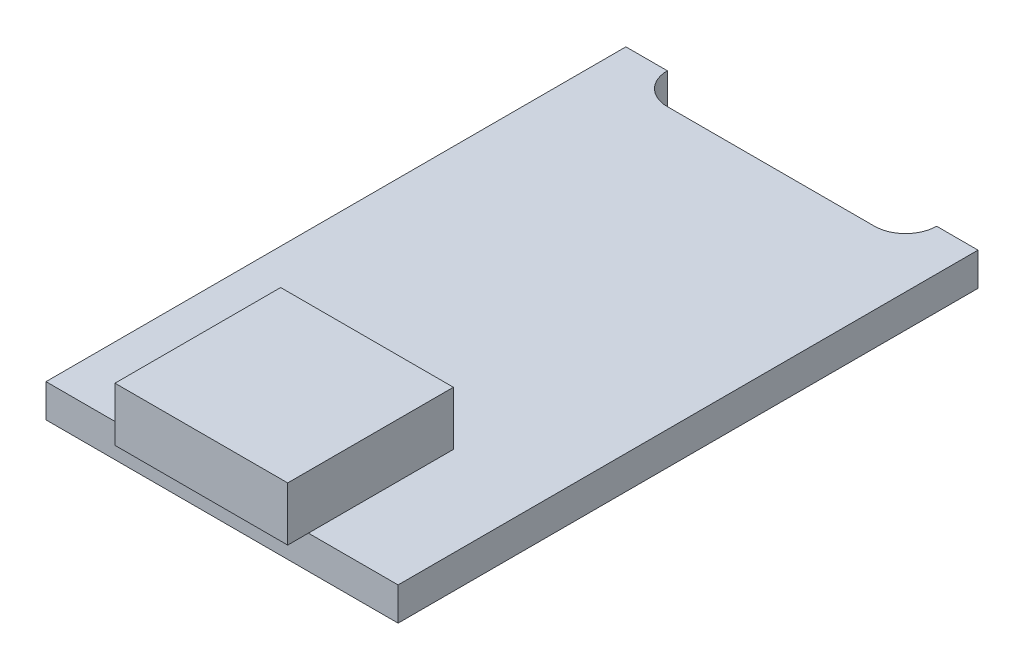
ISO-10303-21;
HEADER;
FILE_DESCRIPTION(('STEP AP214'),'2;1');
FILE_NAME('part.step','',(''),(''),'','','');
FILE_SCHEMA(('AUTOMOTIVE_DESIGN { 1 0 10303 214 1 1 1 1 }'));
ENDSEC;
DATA;
#1=APPLICATION_CONTEXT('core data for automotive mechanical design processes');
#2=APPLICATION_PROTOCOL_DEFINITION('international standard','automotive_design',2000,#1);
#3=PRODUCT_CONTEXT('',#1,'mechanical');
#4=PRODUCT('Part','Part','',(#3));
#5=PRODUCT_RELATED_PRODUCT_CATEGORY('part','',(#4));
#6=PRODUCT_DEFINITION_FORMATION('','',#4);
#7=PRODUCT_DEFINITION_CONTEXT('part definition',#1,'design');
#8=PRODUCT_DEFINITION('design','',#6,#7);
#9=PRODUCT_DEFINITION_SHAPE('','',#8);
#10=(LENGTH_UNIT() NAMED_UNIT(*) SI_UNIT(.MILLI.,.METRE.));
#11=(NAMED_UNIT(*) PLANE_ANGLE_UNIT() SI_UNIT($,.RADIAN.));
#12=(NAMED_UNIT(*) SI_UNIT($,.STERADIAN.) SOLID_ANGLE_UNIT());
#13=UNCERTAINTY_MEASURE_WITH_UNIT(LENGTH_MEASURE(1.E-05),#10,'distance_accuracy_value','');
#14=(GEOMETRIC_REPRESENTATION_CONTEXT(3) GLOBAL_UNCERTAINTY_ASSIGNED_CONTEXT((#13)) GLOBAL_UNIT_ASSIGNED_CONTEXT((#10,
#11,#12)) REPRESENTATION_CONTEXT('',''));
#15=CARTESIAN_POINT('',(0.,0.,0.));
#16=DIRECTION('',(0.,0.,1.));
#17=DIRECTION('',(1.,0.,0.));
#18=AXIS2_PLACEMENT_3D('',#15,#16,#17);
#19=CARTESIAN_POINT('',(-8.5,1.6,-14.));
#20=DIRECTION('',(0.,0.,1.));
#21=DIRECTION('',(1.,0.,0.));
#22=AXIS2_PLACEMENT_3D('',#19,#20,#21);
#23=PLANE('',#22);
#24=DIRECTION('',(-1.,0.,0.));
#25=VECTOR('',#24,1.);
#26=CARTESIAN_POINT('',(-8.5,1.6,-14.));
#27=LINE('',#26,#25);
#28=CARTESIAN_POINT('',(-6.5,1.6,-14.));
#29=VERTEX_POINT('',#28);
#30=CARTESIAN_POINT('',(-8.5,1.6,-14.));
#31=VERTEX_POINT('',#30);
#32=EDGE_CURVE('E225',#29,#31,#27,.T.);
#33=ORIENTED_EDGE('',*,*,#32,.F.);
#34=DIRECTION('',(0.,1.,0.));
#35=VECTOR('',#34,1.);
#36=CARTESIAN_POINT('',(-6.5,0.,-14.));
#37=LINE('',#36,#35);
#38=CARTESIAN_POINT('',(-6.5,0.,-14.));
#39=VERTEX_POINT('',#38);
#40=EDGE_CURVE('E189',#29,#39,#37,.F.);
#41=ORIENTED_EDGE('',*,*,#40,.T.);
#42=DIRECTION('',(-1.,0.,0.));
#43=VECTOR('',#42,1.);
#44=CARTESIAN_POINT('',(-8.5,0.,-14.));
#45=LINE('',#44,#43);
#46=CARTESIAN_POINT('',(-8.5,0.,-14.));
#47=VERTEX_POINT('',#46);
#48=EDGE_CURVE('E150',#39,#47,#45,.T.);
#49=ORIENTED_EDGE('',*,*,#48,.T.);
#50=DIRECTION('',(0.,-1.,0.));
#51=VECTOR('',#50,1.);
#52=CARTESIAN_POINT('',(-8.5,1.6,-14.));
#53=LINE('',#52,#51);
#54=EDGE_CURVE('E176',#31,#47,#53,.T.);
#55=ORIENTED_EDGE('',*,*,#54,.F.);
#56=EDGE_LOOP('',(#33,#41,#49,#55));
#57=FACE_BOUND('',#56,.T.);
#58=ADVANCED_FACE('F36',(#57),#23,.F.);
#59=CARTESIAN_POINT('',(0.,1.6,0.));
#60=DIRECTION('',(0.,-1.,0.));
#61=DIRECTION('',(0.,0.,-1.));
#62=AXIS2_PLACEMENT_3D('',#59,#60,#61);
#63=PLANE('',#62);
#64=DIRECTION('',(1.,0.,0.));
#65=VECTOR('',#64,1.);
#66=CARTESIAN_POINT('',(-5.,1.6,-12.5));
#67=LINE('',#66,#65);
#68=CARTESIAN_POINT('',(-5.,1.6,-12.5));
#69=VERTEX_POINT('',#68);
#70=CARTESIAN_POINT('',(5.,1.6,-12.5));
#71=VERTEX_POINT('',#70);
#72=EDGE_CURVE('E246',#69,#71,#67,.T.);
#73=ORIENTED_EDGE('',*,*,#72,.F.);
#74=CARTESIAN_POINT('',(-5.,1.6,-14.));
#75=DIRECTION('',(0.,1.,0.));
#76=DIRECTION('',(0.,0.,1.));
#77=AXIS2_PLACEMENT_3D('',#74,#75,#76);
#78=CIRCLE('',#77,1.5);
#79=EDGE_CURVE('E135',#29,#69,#78,.T.);
#80=ORIENTED_EDGE('',*,*,#79,.F.);
#81=ORIENTED_EDGE('',*,*,#32,.T.);
#82=DIRECTION('',(0.,0.,1.));
#83=VECTOR('',#82,1.);
#84=CARTESIAN_POINT('',(-8.5,1.6,14.));
#85=LINE('',#84,#83);
#86=CARTESIAN_POINT('',(-8.5,1.6,14.));
#87=VERTEX_POINT('',#86);
#88=EDGE_CURVE('E229',#31,#87,#85,.T.);
#89=ORIENTED_EDGE('',*,*,#88,.T.);
#90=DIRECTION('',(1.,0.,0.));
#91=VECTOR('',#90,1.);
#92=CARTESIAN_POINT('',(-8.5,1.6,14.));
#93=LINE('',#92,#91);
#94=CARTESIAN_POINT('',(-4.17,1.6,14.));
#95=VERTEX_POINT('',#94);
#96=EDGE_CURVE('E173',#87,#95,#93,.T.);
#97=ORIENTED_EDGE('',*,*,#96,.T.);
#98=DIRECTION('',(0.,0.,1.));
#99=VECTOR('',#98,1.);
#100=CARTESIAN_POINT('',(-4.17,1.6,7.));
#101=LINE('',#100,#99);
#102=CARTESIAN_POINT('',(-4.17,1.6,7.));
#103=VERTEX_POINT('',#102);
#104=EDGE_CURVE('E390',#103,#95,#101,.T.);
#105=ORIENTED_EDGE('',*,*,#104,.F.);
#106=DIRECTION('',(-1.,0.,0.));
#107=VECTOR('',#106,1.);
#108=CARTESIAN_POINT('',(-4.17,1.6,7.));
#109=LINE('',#108,#107);
#110=CARTESIAN_POINT('',(4.17,1.6,7.));
#111=VERTEX_POINT('',#110);
#112=EDGE_CURVE('E59',#111,#103,#109,.T.);
#113=ORIENTED_EDGE('',*,*,#112,.F.);
#114=DIRECTION('',(0.,0.,-1.));
#115=VECTOR('',#114,1.);
#116=CARTESIAN_POINT('',(4.17,1.6,7.));
#117=LINE('',#116,#115);
#118=CARTESIAN_POINT('',(4.17,1.6,14.));
#119=VERTEX_POINT('',#118);
#120=EDGE_CURVE('E44',#119,#111,#117,.T.);
#121=ORIENTED_EDGE('',*,*,#120,.F.);
#122=CARTESIAN_POINT('',(8.5,1.6,14.));
#123=VERTEX_POINT('',#122);
#124=EDGE_CURVE('E230',#119,#123,#93,.T.);
#125=ORIENTED_EDGE('',*,*,#124,.T.);
#126=DIRECTION('',(0.,0.,-1.));
#127=VECTOR('',#126,1.);
#128=CARTESIAN_POINT('',(8.5,1.6,14.));
#129=LINE('',#128,#127);
#130=CARTESIAN_POINT('',(8.5,1.6,-14.));
#131=VERTEX_POINT('',#130);
#132=EDGE_CURVE('E168',#123,#131,#129,.T.);
#133=ORIENTED_EDGE('',*,*,#132,.T.);
#134=CARTESIAN_POINT('',(6.5,1.6,-14.));
#135=VERTEX_POINT('',#134);
#136=EDGE_CURVE('E226',#131,#135,#27,.T.);
#137=ORIENTED_EDGE('',*,*,#136,.T.);
#138=CARTESIAN_POINT('',(5.,1.6,-14.));
#139=DIRECTION('',(0.,1.,0.));
#140=DIRECTION('',(0.,0.,1.));
#141=AXIS2_PLACEMENT_3D('',#138,#139,#140);
#142=CIRCLE('',#141,1.5);
#143=EDGE_CURVE('E145',#71,#135,#142,.T.);
#144=ORIENTED_EDGE('',*,*,#143,.F.);
#145=EDGE_LOOP('',(#73,#80,#81,#89,#97,#105,#113,#121,#125,#133,#137,#144));
#146=FACE_BOUND('',#145,.T.);
#147=ADVANCED_FACE('F238',(#146),#63,.F.);
#148=CARTESIAN_POINT('',(8.5,1.6,14.));
#149=DIRECTION('',(-1.,0.,0.));
#150=DIRECTION('',(0.,0.,1.));
#151=AXIS2_PLACEMENT_3D('',#148,#149,#150);
#152=PLANE('',#151);
#153=DIRECTION('',(0.,0.,-1.));
#154=VECTOR('',#153,1.);
#155=CARTESIAN_POINT('',(8.5,0.,14.));
#156=LINE('',#155,#154);
#157=CARTESIAN_POINT('',(8.5,0.,14.));
#158=VERTEX_POINT('',#157);
#159=CARTESIAN_POINT('',(8.5,0.,-14.));
#160=VERTEX_POINT('',#159);
#161=EDGE_CURVE('E157',#158,#160,#156,.T.);
#162=ORIENTED_EDGE('',*,*,#161,.T.);
#163=DIRECTION('',(0.,-1.,0.));
#164=VECTOR('',#163,1.);
#165=CARTESIAN_POINT('',(8.5,1.6,-14.));
#166=LINE('',#165,#164);
#167=EDGE_CURVE('E177',#131,#160,#166,.T.);
#168=ORIENTED_EDGE('',*,*,#167,.F.);
#169=ORIENTED_EDGE('',*,*,#132,.F.);
#170=DIRECTION('',(0.,-1.,0.));
#171=VECTOR('',#170,1.);
#172=CARTESIAN_POINT('',(8.5,1.6,14.));
#173=LINE('',#172,#171);
#174=EDGE_CURVE('E169',#123,#158,#173,.T.);
#175=ORIENTED_EDGE('',*,*,#174,.T.);
#176=EDGE_LOOP('',(#162,#168,#169,#175));
#177=FACE_BOUND('',#176,.T.);
#178=ADVANCED_FACE('F38',(#177),#152,.F.);
#179=CARTESIAN_POINT('',(6.5,0.,-14.));
#180=VERTEX_POINT('',#179);
#181=EDGE_CURVE('E156',#160,#180,#45,.T.);
#182=ORIENTED_EDGE('',*,*,#181,.T.);
#183=DIRECTION('',(0.,1.,0.));
#184=VECTOR('',#183,1.);
#185=CARTESIAN_POINT('',(6.5,0.,-14.));
#186=LINE('',#185,#184);
#187=EDGE_CURVE('E193',#180,#135,#186,.T.);
#188=ORIENTED_EDGE('',*,*,#187,.T.);
#189=ORIENTED_EDGE('',*,*,#136,.F.);
#190=ORIENTED_EDGE('',*,*,#167,.T.);
#191=EDGE_LOOP('',(#182,#188,#189,#190));
#192=FACE_BOUND('',#191,.T.);
#193=ADVANCED_FACE('F244',(#192),#23,.F.);
#194=CARTESIAN_POINT('',(-8.5,1.6,14.));
#195=DIRECTION('',(1.,0.,0.));
#196=DIRECTION('',(0.,0.,-1.));
#197=AXIS2_PLACEMENT_3D('',#194,#195,#196);
#198=PLANE('',#197);
#199=DIRECTION('',(0.,0.,1.));
#200=VECTOR('',#199,1.);
#201=CARTESIAN_POINT('',(-8.5,0.,14.));
#202=LINE('',#201,#200);
#203=CARTESIAN_POINT('',(-8.5,0.,14.));
#204=VERTEX_POINT('',#203);
#205=EDGE_CURVE('E152',#47,#204,#202,.T.);
#206=ORIENTED_EDGE('',*,*,#205,.T.);
#207=DIRECTION('',(0.,-1.,0.));
#208=VECTOR('',#207,1.);
#209=CARTESIAN_POINT('',(-8.5,1.6,14.));
#210=LINE('',#209,#208);
#211=EDGE_CURVE('E172',#87,#204,#210,.T.);
#212=ORIENTED_EDGE('',*,*,#211,.F.);
#213=ORIENTED_EDGE('',*,*,#88,.F.);
#214=ORIENTED_EDGE('',*,*,#54,.T.);
#215=EDGE_LOOP('',(#206,#212,#213,#214));
#216=FACE_BOUND('',#215,.T.);
#217=ADVANCED_FACE('F268',(#216),#198,.F.);
#218=CARTESIAN_POINT('',(-8.5,1.6,14.));
#219=DIRECTION('',(0.,0.,-1.));
#220=DIRECTION('',(-1.,0.,0.));
#221=AXIS2_PLACEMENT_3D('',#218,#219,#220);
#222=PLANE('',#221);
#223=DIRECTION('',(1.,0.,0.));
#224=VECTOR('',#223,1.);
#225=CARTESIAN_POINT('',(-8.5,0.,14.));
#226=LINE('',#225,#224);
#227=EDGE_CURVE('E166',#204,#158,#226,.T.);
#228=ORIENTED_EDGE('',*,*,#227,.T.);
#229=ORIENTED_EDGE('',*,*,#174,.F.);
#230=ORIENTED_EDGE('',*,*,#124,.F.);
#231=EDGE_CURVE('E232',#95,#119,#93,.T.);
#232=ORIENTED_EDGE('',*,*,#231,.F.);
#233=ORIENTED_EDGE('',*,*,#96,.F.);
#234=ORIENTED_EDGE('',*,*,#211,.T.);
#235=EDGE_LOOP('',(#228,#229,#230,#232,#233,#234));
#236=FACE_BOUND('',#235,.T.);
#237=ADVANCED_FACE('F241',(#236),#222,.F.);
#238=CARTESIAN_POINT('',(0.,0.,0.));
#239=DIRECTION('',(0.,-1.,0.));
#240=DIRECTION('',(0.,0.,-1.));
#241=AXIS2_PLACEMENT_3D('',#238,#239,#240);
#242=PLANE('',#241);
#243=CARTESIAN_POINT('',(-5.,0.,-14.));
#244=DIRECTION('',(0.,-1.,0.));
#245=DIRECTION('',(0.,0.,-1.));
#246=AXIS2_PLACEMENT_3D('',#243,#244,#245);
#247=CIRCLE('',#246,1.5);
#248=CARTESIAN_POINT('',(-5.,0.,-12.5));
#249=VERTEX_POINT('',#248);
#250=EDGE_CURVE('E11',#249,#39,#247,.T.);
#251=ORIENTED_EDGE('',*,*,#250,.F.);
#252=DIRECTION('',(1.,0.,0.));
#253=VECTOR('',#252,1.);
#254=CARTESIAN_POINT('',(-5.,0.,-12.5));
#255=LINE('',#254,#253);
#256=CARTESIAN_POINT('',(5.,0.,-12.5));
#257=VERTEX_POINT('',#256);
#258=EDGE_CURVE('E142',#249,#257,#255,.T.);
#259=ORIENTED_EDGE('',*,*,#258,.T.);
#260=CARTESIAN_POINT('',(5.,0.,-14.));
#261=DIRECTION('',(0.,1.,0.));
#262=DIRECTION('',(0.,0.,1.));
#263=AXIS2_PLACEMENT_3D('',#260,#261,#262);
#264=CIRCLE('',#263,1.5);
#265=EDGE_CURVE('E51',#257,#180,#264,.T.);
#266=ORIENTED_EDGE('',*,*,#265,.T.);
#267=ORIENTED_EDGE('',*,*,#181,.F.);
#268=ORIENTED_EDGE('',*,*,#161,.F.);
#269=ORIENTED_EDGE('',*,*,#227,.F.);
#270=ORIENTED_EDGE('',*,*,#205,.F.);
#271=ORIENTED_EDGE('',*,*,#48,.F.);
#272=EDGE_LOOP('',(#251,#259,#266,#267,#268,#269,#270,#271));
#273=FACE_BOUND('',#272,.T.);
#274=ADVANCED_FACE('F148',(#273),#242,.T.);
#275=CARTESIAN_POINT('',(0.,1.6,0.));
#276=DIRECTION('',(0.,1.,0.));
#277=DIRECTION('',(0.,0.,1.));
#278=AXIS2_PLACEMENT_3D('',#275,#276,#277);
#279=PLANE('',#278);
#280=CARTESIAN_POINT('',(-4.17,1.6,15.));
#281=VERTEX_POINT('',#280);
#282=EDGE_CURVE('E192',#95,#281,#101,.T.);
#283=ORIENTED_EDGE('',*,*,#282,.F.);
#284=ORIENTED_EDGE('',*,*,#231,.T.);
#285=CARTESIAN_POINT('',(4.17,1.6,15.));
#286=VERTEX_POINT('',#285);
#287=EDGE_CURVE('E182',#286,#119,#117,.T.);
#288=ORIENTED_EDGE('',*,*,#287,.F.);
#289=DIRECTION('',(1.,0.,0.));
#290=VECTOR('',#289,1.);
#291=CARTESIAN_POINT('',(-4.17,1.6,15.));
#292=LINE('',#291,#290);
#293=EDGE_CURVE('E203',#281,#286,#292,.T.);
#294=ORIENTED_EDGE('',*,*,#293,.F.);
#295=EDGE_LOOP('',(#283,#284,#288,#294));
#296=FACE_BOUND('',#295,.T.);
#297=ADVANCED_FACE('F299',(#296),#279,.F.);
#298=CARTESIAN_POINT('',(4.17,4.2,7.));
#299=DIRECTION('',(-1.,0.,0.));
#300=DIRECTION('',(0.,0.,1.));
#301=AXIS2_PLACEMENT_3D('',#298,#299,#300);
#302=PLANE('',#301);
#303=ORIENTED_EDGE('',*,*,#287,.T.);
#304=ORIENTED_EDGE('',*,*,#120,.T.);
#305=DIRECTION('',(0.,-1.,0.));
#306=VECTOR('',#305,1.);
#307=CARTESIAN_POINT('',(4.17,4.2,7.));
#308=LINE('',#307,#306);
#309=CARTESIAN_POINT('',(4.17,4.2,7.));
#310=VERTEX_POINT('',#309);
#311=EDGE_CURVE('E161',#310,#111,#308,.T.);
#312=ORIENTED_EDGE('',*,*,#311,.F.);
#313=DIRECTION('',(0.,0.,-1.));
#314=VECTOR('',#313,1.);
#315=CARTESIAN_POINT('',(4.17,4.2,7.));
#316=LINE('',#315,#314);
#317=CARTESIAN_POINT('',(4.17,4.2,15.));
#318=VERTEX_POINT('',#317);
#319=EDGE_CURVE('E199',#318,#310,#316,.T.);
#320=ORIENTED_EDGE('',*,*,#319,.F.);
#321=DIRECTION('',(0.,-1.,0.));
#322=VECTOR('',#321,1.);
#323=CARTESIAN_POINT('',(4.17,4.2,15.));
#324=LINE('',#323,#322);
#325=EDGE_CURVE('E207',#318,#286,#324,.T.);
#326=ORIENTED_EDGE('',*,*,#325,.T.);
#327=EDGE_LOOP('',(#303,#304,#312,#320,#326));
#328=FACE_BOUND('',#327,.T.);
#329=ADVANCED_FACE('F348',(#328),#302,.F.);
#330=CARTESIAN_POINT('',(-4.17,4.2,7.));
#331=DIRECTION('',(0.,0.,1.));
#332=DIRECTION('',(1.,0.,0.));
#333=AXIS2_PLACEMENT_3D('',#330,#331,#332);
#334=PLANE('',#333);
#335=ORIENTED_EDGE('',*,*,#112,.T.);
#336=DIRECTION('',(0.,-1.,0.));
#337=VECTOR('',#336,1.);
#338=CARTESIAN_POINT('',(-4.17,4.2,7.));
#339=LINE('',#338,#337);
#340=CARTESIAN_POINT('',(-4.17,4.2,7.));
#341=VERTEX_POINT('',#340);
#342=EDGE_CURVE('E215',#341,#103,#339,.T.);
#343=ORIENTED_EDGE('',*,*,#342,.F.);
#344=DIRECTION('',(-1.,0.,0.));
#345=VECTOR('',#344,1.);
#346=CARTESIAN_POINT('',(-4.17,4.2,7.));
#347=LINE('',#346,#345);
#348=EDGE_CURVE('E202',#310,#341,#347,.T.);
#349=ORIENTED_EDGE('',*,*,#348,.F.);
#350=ORIENTED_EDGE('',*,*,#311,.T.);
#351=EDGE_LOOP('',(#335,#343,#349,#350));
#352=FACE_BOUND('',#351,.T.);
#353=ADVANCED_FACE('F340',(#352),#334,.F.);
#354=CARTESIAN_POINT('',(-4.17,4.2,7.));
#355=DIRECTION('',(1.,0.,0.));
#356=DIRECTION('',(0.,0.,-1.));
#357=AXIS2_PLACEMENT_3D('',#354,#355,#356);
#358=PLANE('',#357);
#359=ORIENTED_EDGE('',*,*,#104,.T.);
#360=ORIENTED_EDGE('',*,*,#282,.T.);
#361=DIRECTION('',(0.,-1.,0.));
#362=VECTOR('',#361,1.);
#363=CARTESIAN_POINT('',(-4.17,4.2,15.));
#364=LINE('',#363,#362);
#365=CARTESIAN_POINT('',(-4.17,4.2,15.));
#366=VERTEX_POINT('',#365);
#367=EDGE_CURVE('E211',#366,#281,#364,.T.);
#368=ORIENTED_EDGE('',*,*,#367,.F.);
#369=DIRECTION('',(0.,0.,1.));
#370=VECTOR('',#369,1.);
#371=CARTESIAN_POINT('',(-4.17,4.2,7.));
#372=LINE('',#371,#370);
#373=EDGE_CURVE('E205',#341,#366,#372,.T.);
#374=ORIENTED_EDGE('',*,*,#373,.F.);
#375=ORIENTED_EDGE('',*,*,#342,.T.);
#376=EDGE_LOOP('',(#359,#360,#368,#374,#375));
#377=FACE_BOUND('',#376,.T.);
#378=ADVANCED_FACE('F332',(#377),#358,.F.);
#379=CARTESIAN_POINT('',(-4.17,4.2,15.));
#380=DIRECTION('',(0.,0.,-1.));
#381=DIRECTION('',(-1.,0.,0.));
#382=AXIS2_PLACEMENT_3D('',#379,#380,#381);
#383=PLANE('',#382);
#384=ORIENTED_EDGE('',*,*,#293,.T.);
#385=ORIENTED_EDGE('',*,*,#325,.F.);
#386=DIRECTION('',(1.,0.,0.));
#387=VECTOR('',#386,1.);
#388=CARTESIAN_POINT('',(-4.17,4.2,15.));
#389=LINE('',#388,#387);
#390=EDGE_CURVE('E206',#366,#318,#389,.T.);
#391=ORIENTED_EDGE('',*,*,#390,.F.);
#392=ORIENTED_EDGE('',*,*,#367,.T.);
#393=EDGE_LOOP('',(#384,#385,#391,#392));
#394=FACE_BOUND('',#393,.T.);
#395=ADVANCED_FACE('F325',(#394),#383,.F.);
#396=CARTESIAN_POINT('',(0.,4.2,0.));
#397=DIRECTION('',(0.,1.,0.));
#398=DIRECTION('',(0.,0.,1.));
#399=AXIS2_PLACEMENT_3D('',#396,#397,#398);
#400=PLANE('',#399);
#401=ORIENTED_EDGE('',*,*,#319,.T.);
#402=ORIENTED_EDGE('',*,*,#348,.T.);
#403=ORIENTED_EDGE('',*,*,#373,.T.);
#404=ORIENTED_EDGE('',*,*,#390,.T.);
#405=EDGE_LOOP('',(#401,#402,#403,#404));
#406=FACE_BOUND('',#405,.T.);
#407=ADVANCED_FACE('F259',(#406),#400,.T.);
#408=CARTESIAN_POINT('',(-5.,0.,-14.));
#409=DIRECTION('',(0.,1.,0.));
#410=DIRECTION('',(0.,0.,1.));
#411=AXIS2_PLACEMENT_3D('',#408,#409,#410);
#412=CYLINDRICAL_SURFACE('',#411,1.5);
#413=ORIENTED_EDGE('',*,*,#79,.T.);
#414=DIRECTION('',(0.,1.,0.));
#415=VECTOR('',#414,1.);
#416=CARTESIAN_POINT('',(-5.,0.,-12.5));
#417=LINE('',#416,#415);
#418=EDGE_CURVE('E129',#249,#69,#417,.T.);
#419=ORIENTED_EDGE('',*,*,#418,.F.);
#420=ORIENTED_EDGE('',*,*,#250,.T.);
#421=ORIENTED_EDGE('',*,*,#40,.F.);
#422=EDGE_LOOP('',(#413,#419,#420,#421));
#423=FACE_BOUND('',#422,.T.);
#424=ADVANCED_FACE('F131',(#423),#412,.F.);
#425=CARTESIAN_POINT('',(5.,0.,-14.));
#426=DIRECTION('',(0.,1.,0.));
#427=DIRECTION('',(0.,0.,1.));
#428=AXIS2_PLACEMENT_3D('',#425,#426,#427);
#429=CYLINDRICAL_SURFACE('',#428,1.5);
#430=ORIENTED_EDGE('',*,*,#265,.F.);
#431=DIRECTION('',(0.,1.,0.));
#432=VECTOR('',#431,1.);
#433=CARTESIAN_POINT('',(5.,0.,-12.5));
#434=LINE('',#433,#432);
#435=EDGE_CURVE('E139',#257,#71,#434,.T.);
#436=ORIENTED_EDGE('',*,*,#435,.T.);
#437=ORIENTED_EDGE('',*,*,#143,.T.);
#438=ORIENTED_EDGE('',*,*,#187,.F.);
#439=EDGE_LOOP('',(#430,#436,#437,#438));
#440=FACE_BOUND('',#439,.T.);
#441=ADVANCED_FACE('F251',(#440),#429,.F.);
#442=CARTESIAN_POINT('',(-5.,0.,-12.5));
#443=DIRECTION('',(0.,0.,1.));
#444=DIRECTION('',(1.,0.,0.));
#445=AXIS2_PLACEMENT_3D('',#442,#443,#444);
#446=PLANE('',#445);
#447=ORIENTED_EDGE('',*,*,#72,.T.);
#448=ORIENTED_EDGE('',*,*,#435,.F.);
#449=ORIENTED_EDGE('',*,*,#258,.F.);
#450=ORIENTED_EDGE('',*,*,#418,.T.);
#451=EDGE_LOOP('',(#447,#448,#449,#450));
#452=FACE_BOUND('',#451,.T.);
#453=ADVANCED_FACE('F143',(#452),#446,.F.);
#454=CLOSED_SHELL('',(#58,#147,#178,#193,#217,#237,#274,#297,#329,#353,#378,#395,#407,#424,#441,#453));
#455=MANIFOLD_SOLID_BREP('B2',#454);
#456=ADVANCED_BREP_SHAPE_REPRESENTATION('',(#18,#455),#14);
#457=SHAPE_DEFINITION_REPRESENTATION(#9,#456);
ENDSEC;
END-ISO-10303-21;
